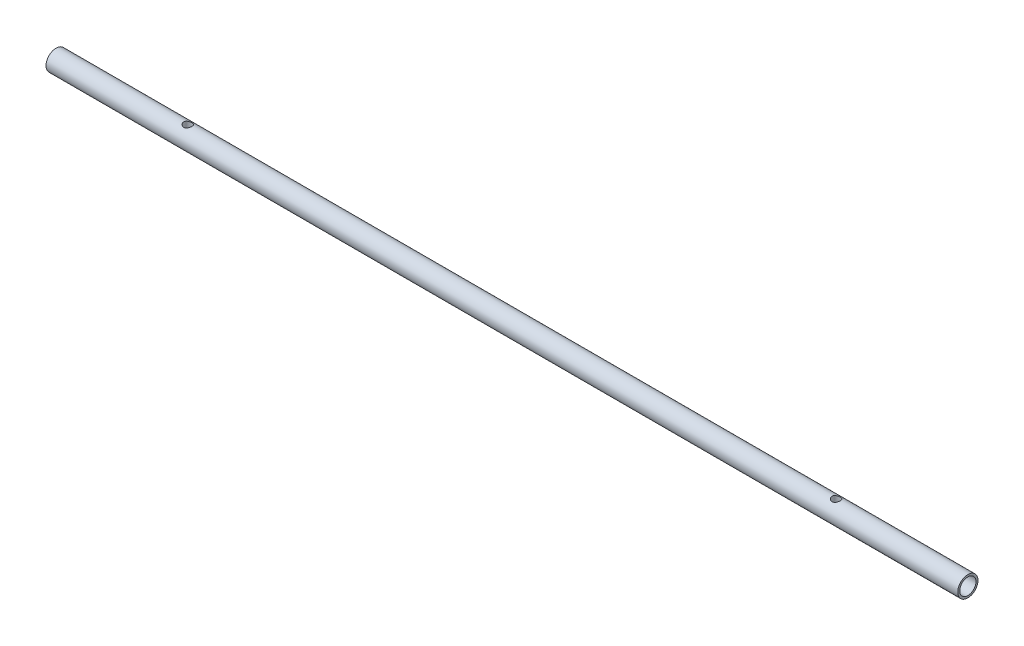
ISO-10303-21;
HEADER;
FILE_DESCRIPTION(('STEP AP214'),'2;1');
FILE_NAME('part.step','',(''),(''),'','','');
FILE_SCHEMA(('AUTOMOTIVE_DESIGN { 1 0 10303 214 1 1 1 1 }'));
ENDSEC;
DATA;
#1=APPLICATION_CONTEXT('core data for automotive mechanical design processes');
#2=APPLICATION_PROTOCOL_DEFINITION('international standard','automotive_design',2000,#1);
#3=PRODUCT_CONTEXT('',#1,'mechanical');
#4=PRODUCT('Part','Part','',(#3));
#5=PRODUCT_RELATED_PRODUCT_CATEGORY('part','',(#4));
#6=PRODUCT_DEFINITION_FORMATION('','',#4);
#7=PRODUCT_DEFINITION_CONTEXT('part definition',#1,'design');
#8=PRODUCT_DEFINITION('design','',#6,#7);
#9=PRODUCT_DEFINITION_SHAPE('','',#8);
#10=(LENGTH_UNIT() NAMED_UNIT(*) SI_UNIT(.MILLI.,.METRE.));
#11=(NAMED_UNIT(*) PLANE_ANGLE_UNIT() SI_UNIT($,.RADIAN.));
#12=(NAMED_UNIT(*) SI_UNIT($,.STERADIAN.) SOLID_ANGLE_UNIT());
#13=UNCERTAINTY_MEASURE_WITH_UNIT(LENGTH_MEASURE(1.E-05),#10,'distance_accuracy_value','');
#14=(GEOMETRIC_REPRESENTATION_CONTEXT(3) GLOBAL_UNCERTAINTY_ASSIGNED_CONTEXT((#13)) GLOBAL_UNIT_ASSIGNED_CONTEXT((#10,
#11,#12)) REPRESENTATION_CONTEXT('',''));
#15=CARTESIAN_POINT('',(0.,0.,0.));
#16=DIRECTION('',(0.,0.,1.));
#17=DIRECTION('',(1.,0.,0.));
#18=AXIS2_PLACEMENT_3D('',#15,#16,#17);
#19=CARTESIAN_POINT('',(900.,0.,0.));
#20=DIRECTION('',(-1.,0.,0.));
#21=DIRECTION('',(0.,0.,1.));
#22=AXIS2_PLACEMENT_3D('',#19,#20,#21);
#23=CYLINDRICAL_SURFACE('',#22,10.);
#24=CARTESIAN_POINT('',(900.,0.,0.));
#25=DIRECTION('',(1.,0.,0.));
#26=DIRECTION('',(0.,0.,-1.));
#27=AXIS2_PLACEMENT_3D('',#24,#25,#26);
#28=CIRCLE('',#27,10.);
#29=CARTESIAN_POINT('',(900.,0.,-10.));
#30=VERTEX_POINT('',#29);
#31=EDGE_CURVE('E10',#30,#30,#28,.T.);
#32=ORIENTED_EDGE('',*,*,#31,.F.);
#33=EDGE_LOOP('',(#32));
#34=FACE_BOUND('',#33,.T.);
#35=CARTESIAN_POINT('',(0.,0.,0.));
#36=DIRECTION('',(1.,0.,0.));
#37=DIRECTION('',(0.,0.,-1.));
#38=AXIS2_PLACEMENT_3D('',#35,#36,#37);
#39=CIRCLE('',#38,10.);
#40=CARTESIAN_POINT('',(0.,0.,-10.));
#41=VERTEX_POINT('',#40);
#42=EDGE_CURVE('E47',#41,#41,#39,.T.);
#43=ORIENTED_EDGE('',*,*,#42,.T.);
#44=EDGE_LOOP('',(#43));
#45=FACE_BOUND('',#44,.T.);
#46=CARTESIAN_POINT('',(770.,-9.1651513899117,-3.99999999999996));
#47=CARTESIAN_POINT('',(770.107177496784,-9.16515220722508,-3.99999917996681));
#48=CARTESIAN_POINT('',(770.214387859795,-9.1670378270459,-3.99568627578827));
#49=CARTESIAN_POINT('',(770.428032094171,-9.1745189058127,-3.97847804504311));
#50=CARTESIAN_POINT('',(770.534465449945,-9.18011663538448,-3.96557746554294));
#51=CARTESIAN_POINT('',(770.745935953355,-9.19485078616076,-3.93129357708775));
#52=CARTESIAN_POINT('',(770.850969884849,-9.20399425848328,-3.90989336356568));
#53=CARTESIAN_POINT('',(771.05868759719,-9.22551446198261,-3.85883937208576));
#54=CARTESIAN_POINT('',(771.161370383102,-9.23789253541713,-3.82918216740125));
#55=CARTESIAN_POINT('',(771.463989726629,-9.27920231487637,-3.72849978450441));
#56=CARTESIAN_POINT('',(771.659537920964,-9.31238810193526,-3.6455922809956));
#57=CARTESIAN_POINT('',(772.033801268673,-9.38629512671439,-3.45083256453886));
#58=CARTESIAN_POINT('',(772.212520085891,-9.42701471853534,-3.33898667159602));
#59=CARTESIAN_POINT('',(772.558511813601,-9.51401677460926,-3.08264624953203));
#60=CARTESIAN_POINT('',(772.724710433289,-9.56047821792021,-2.93675933272146));
#61=CARTESIAN_POINT('',(773.031060408042,-9.65224928088017,-2.61941759406607));
#62=CARTESIAN_POINT('',(773.171202660755,-9.69755849326326,-2.44795387495429));
#63=CARTESIAN_POINT('',(773.426812109837,-9.78406811808173,-2.07601279575006));
#64=CARTESIAN_POINT('',(773.541088419969,-9.82503606295844,-1.87465797803879));
#65=CARTESIAN_POINT('',(773.733687319677,-9.89607856333947,-1.45365059895523));
#66=CARTESIAN_POINT('',(773.812024539433,-9.92615755049621,-1.23400552632842));
#67=CARTESIAN_POINT('',(773.926682927323,-9.97076649749864,-0.793932865332514));
#68=CARTESIAN_POINT('',(773.964854615998,-9.98597873479394,-0.574057972725617));
#69=CARTESIAN_POINT('',(774.004056983501,-10.001606214367,-0.13053265416026));
#70=CARTESIAN_POINT('',(774.005101515044,-10.0020269755724,0.0931163324630192));
#71=CARTESIAN_POINT('',(773.971034457453,-9.98843925626006,0.524464988663833));
#72=CARTESIAN_POINT('',(773.937950453703,-9.97523993538891,0.73235490554236));
#73=CARTESIAN_POINT('',(773.840014248182,-9.93698582942364,1.13934621864219));
#74=CARTESIAN_POINT('',(773.775159715415,-9.91193017443786,1.33844696883592));
#75=CARTESIAN_POINT('',(773.614727034028,-9.85193648913818,1.72579587696661));
#76=CARTESIAN_POINT('',(773.518700570311,-9.81685520932149,1.91383524674304));
#77=CARTESIAN_POINT('',(773.29906998622,-9.74029170360854,2.27161630149706));
#78=CARTESIAN_POINT('',(773.175456413816,-9.69880728534385,2.44135168543978));
#79=CARTESIAN_POINT('',(772.894701728095,-9.61043274352162,2.76953765597588));
#80=CARTESIAN_POINT('',(772.73589221485,-9.56336653023499,2.92651569053131));
#81=CARTESIAN_POINT('',(772.394018856341,-9.47123321946556,3.21221483078627));
#82=CARTESIAN_POINT('',(772.21094710361,-9.42616678016166,3.34092668757409));
#83=CARTESIAN_POINT('',(771.819161955251,-9.34193794818047,3.56980837743803));
#84=CARTESIAN_POINT('',(771.609870339322,-9.30297828115422,3.66906930327224));
#85=CARTESIAN_POINT('',(771.175569019376,-9.23775180688179,3.83035251973281));
#86=CARTESIAN_POINT('',(770.950569630547,-9.2114767578263,3.8923989967558));
#87=CARTESIAN_POINT('',(770.505928445065,-9.1765951940544,3.97390989770958));
#88=CARTESIAN_POINT('',(770.286799105743,-9.16700732912284,3.99574419362888));
#89=CARTESIAN_POINT('',(769.847845584481,-9.16378995738086,4.00312265288558));
#90=CARTESIAN_POINT('',(769.628021633449,-9.17015561120733,3.98867782118237));
#91=CARTESIAN_POINT('',(769.207082130086,-9.19712088718237,3.92606578957984));
#92=CARTESIAN_POINT('',(769.0056141252,-9.21688915596613,3.87986612404747));
#93=CARTESIAN_POINT('',(768.613423190429,-9.26740102054689,3.75760837382151));
#94=CARTESIAN_POINT('',(768.422702653785,-9.29814704977204,3.68154366860436));
#95=CARTESIAN_POINT('',(768.048795284409,-9.36867563720211,3.49827127896289));
#96=CARTESIAN_POINT('',(767.866227622613,-9.40877409278365,3.38992573652891));
#97=CARTESIAN_POINT('',(767.521034025115,-9.49300770315595,3.14633044888357));
#98=CARTESIAN_POINT('',(767.358416254402,-9.53714449792086,3.01106974696415));
#99=CARTESIAN_POINT('',(767.045253182809,-9.62841831942848,2.70568842336037));
#100=CARTESIAN_POINT('',(766.896486869446,-9.67553614570512,2.53373085888834));
#101=CARTESIAN_POINT('',(766.629645846752,-9.76439589135028,2.16616726673914));
#102=CARTESIAN_POINT('',(766.511572386703,-9.80613759186125,1.97056027694174));
#103=CARTESIAN_POINT('',(766.309904747181,-9.87967431800932,1.56055986799716));
#104=CARTESIAN_POINT('',(766.226302312053,-9.91147172481882,1.34617096196484));
#105=CARTESIAN_POINT('',(766.096902294801,-9.9614542693725,0.904787181861416));
#106=CARTESIAN_POINT('',(766.051084195687,-9.9796467941012,0.677799220674651));
#107=CARTESIAN_POINT('',(766.000990598089,-9.99958016425669,0.233633020611835));
#108=CARTESIAN_POINT('',(765.994199747923,-10.0023169350655,0.0167809848941689));
#109=CARTESIAN_POINT('',(766.015710953721,-9.9937208474038,-0.414867671174849));
#110=CARTESIAN_POINT('',(766.044007697521,-9.98239011871254,-0.629664597703008));
#111=CARTESIAN_POINT('',(766.133093594213,-9.94743026789157,-1.04434180494589));
#112=CARTESIAN_POINT('',(766.192857956505,-9.92418961491738,-1.24447761316997));
#113=CARTESIAN_POINT('',(766.342105544758,-9.86789895440955,-1.63184470564409));
#114=CARTESIAN_POINT('',(766.431594252056,-9.83484713776135,-1.81907360209117));
#115=CARTESIAN_POINT('',(766.642206647569,-9.76036189588763,-2.18440609879399));
#116=CARTESIAN_POINT('',(766.764553544096,-9.71862262764551,-2.36174083104884));
#117=CARTESIAN_POINT('',(767.035576083636,-9.63178803063431,-2.6941079995884));
#118=CARTESIAN_POINT('',(767.184262624039,-9.58669131729773,-2.84913115669901));
#119=CARTESIAN_POINT('',(767.514634238866,-9.49475540255922,-3.14240275826144));
#120=CARTESIAN_POINT('',(767.697792298702,-9.44798115653708,-3.27901865020177));
#121=CARTESIAN_POINT('',(768.085869721248,-9.36099292501488,-3.51969402497225));
#122=CARTESIAN_POINT('',(768.290791638666,-9.32077971107737,-3.62374968011084));
#123=CARTESIAN_POINT('',(768.69812394378,-9.25517900642369,-3.78798515690828));
#124=CARTESIAN_POINT('',(768.899107675946,-9.22878451494603,-3.85126569346865));
#125=CARTESIAN_POINT('',(769.206638959791,-9.19885565843391,-3.92194632104982));
#126=CARTESIAN_POINT('',(769.310073035894,-9.19049270633768,-3.94146052144915));
#127=CARTESIAN_POINT('',(769.518356929611,-9.17721200341613,-3.9722885067968));
#128=CARTESIAN_POINT('',(769.623205889396,-9.17229225293173,-3.98360705155151));
#129=CARTESIAN_POINT('',(769.773550591352,-9.16783675423419,-3.99384232103279));
#130=CARTESIAN_POINT('',(769.818799830322,-9.16683059815416,-3.99615058414989));
#131=CARTESIAN_POINT('',(769.909364084215,-9.16548771864779,-3.99922965337519));
#132=CARTESIAN_POINT('',(769.954679103716,-9.16515104430394,-4.00000034675779));
#133=CARTESIAN_POINT('',(770.,-9.1651513899117,-3.99999999999996));
#134=B_SPLINE_CURVE_WITH_KNOTS('',3,(#46,#47,#48,#49,#50,#51,#52,#53,#54,#55,#56,#57,#58,#59,
#60,#61,#62,#63,#64,#65,#66,#67,#68,#69,#70,#71,#72,#73,#74,#75,#76,#77,#78,#79,#80,#81,#82,#83,
#84,#85,#86,#87,#88,#89,#90,#91,#92,#93,#94,#95,#96,#97,#98,#99,#100,#101,#102,#103,#104,#105,
#106,#107,#108,#109,#110,#111,#112,#113,#114,#115,#116,#117,#118,#119,#120,#121,#122,#123,#124,
#125,#126,#127,#128,#129,#130,#131,#132,#133),.UNSPECIFIED.,.T.,.F.,(4,2,2,2,2,2,2,2,2,2,2,2,2,
2,2,2,2,2,2,2,2,2,2,2,2,2,2,2,2,2,2,2,2,2,2,2,2,2,2,2,2,2,2,4),(0.,0.321486083338427,
0.643168995111234,0.965494918272602,1.28795480954357,1.92974178448591,2.57138871437629,
3.2463125035875,3.92147162486584,4.62325351972751,5.32474947728853,5.9922837956426,
6.65956904401237,7.28937303450495,7.9192232404801,8.55856614259682,9.19812843669946,
9.87968101952588,10.5614562804413,11.262489312244,11.9630662339009,12.6208430883872,
13.2784204360576,13.8985450996018,14.5188073109315,15.1642232309528,15.8099024284157,
16.5032748228382,17.1966754349536,17.8899098841549,18.5827676569813,19.2304209330176,
19.8779761681506,20.5056400267656,21.1334196944702,21.788941160697,22.4447344691826,
23.1411252036108,23.8375977730822,24.47153335428,24.7879924179089,25.1042675432741,
25.2402006430812,25.3761437083403),.UNSPECIFIED.);
#135=CARTESIAN_POINT('',(770.,-9.1651513899117,-3.99999999999996));
#136=VERTEX_POINT('',#135);
#137=EDGE_CURVE('E58',#136,#136,#134,.T.);
#138=ORIENTED_EDGE('',*,*,#137,.F.);
#139=EDGE_LOOP('',(#138));
#140=FACE_BOUND('',#139,.T.);
#141=CARTESIAN_POINT('',(770.,9.1651513899117,-3.99999999999996));
#142=CARTESIAN_POINT('',(769.892822503216,9.16515220722508,-3.99999917996681));
#143=CARTESIAN_POINT('',(769.785612140205,9.1670378270459,-3.99568627578827));
#144=CARTESIAN_POINT('',(769.571967905829,9.1745189058127,-3.97847804504311));
#145=CARTESIAN_POINT('',(769.465534550055,9.18011663538448,-3.96557746554295));
#146=CARTESIAN_POINT('',(769.254064046645,9.19485078616075,-3.93129357708776));
#147=CARTESIAN_POINT('',(769.149030115152,9.20399425848328,-3.90989336356569));
#148=CARTESIAN_POINT('',(768.94131240281,9.22551446198261,-3.85883937208576));
#149=CARTESIAN_POINT('',(768.838629616898,9.23789253541713,-3.82918216740125));
#150=CARTESIAN_POINT('',(768.536010273372,9.27920231487637,-3.72849978450441));
#151=CARTESIAN_POINT('',(768.340462079036,9.31238810193526,-3.6455922809956));
#152=CARTESIAN_POINT('',(767.966198731327,9.38629512671439,-3.45083256453886));
#153=CARTESIAN_POINT('',(767.787479914109,9.42701471853534,-3.33898667159601));
#154=CARTESIAN_POINT('',(767.441488186399,9.51401677460926,-3.08264624953205));
#155=CARTESIAN_POINT('',(767.275289566711,9.5604782179202,-2.93675933272151));
#156=CARTESIAN_POINT('',(766.968939591958,9.65224928088016,-2.61941759406611));
#157=CARTESIAN_POINT('',(766.828797339245,9.69755849326325,-2.4479538749543));
#158=CARTESIAN_POINT('',(766.573187890163,9.78406811808173,-2.07601279575006));
#159=CARTESIAN_POINT('',(766.458911580031,9.82503606295844,-1.87465797803879));
#160=CARTESIAN_POINT('',(766.266312680323,9.89607856333947,-1.45365059895523));
#161=CARTESIAN_POINT('',(766.187975460567,9.92615755049621,-1.23400552632842));
#162=CARTESIAN_POINT('',(766.073317072677,9.97076649749864,-0.793932865332513));
#163=CARTESIAN_POINT('',(766.035145384002,9.98597873479394,-0.574057972725617));
#164=CARTESIAN_POINT('',(765.995943016499,10.001606214367,-0.13053265416026));
#165=CARTESIAN_POINT('',(765.994898484956,10.0020269755724,0.0931163324630191));
#166=CARTESIAN_POINT('',(766.028965542547,9.98843925626006,0.524464988663833));
#167=CARTESIAN_POINT('',(766.062049546297,9.97523993538891,0.73235490554236));
#168=CARTESIAN_POINT('',(766.159985751818,9.93698582942364,1.13934621864219));
#169=CARTESIAN_POINT('',(766.224840284585,9.91193017443786,1.33844696883592));
#170=CARTESIAN_POINT('',(766.385272965972,9.85193648913818,1.72579587696661));
#171=CARTESIAN_POINT('',(766.481299429689,9.81685520932149,1.91383524674304));
#172=CARTESIAN_POINT('',(766.700930013781,9.74029170360854,2.27161630149706));
#173=CARTESIAN_POINT('',(766.824543586184,9.69880728534385,2.44135168543978));
#174=CARTESIAN_POINT('',(767.105298271905,9.61043274352162,2.76953765597588));
#175=CARTESIAN_POINT('',(767.26410778515,9.56336653023499,2.92651569053131));
#176=CARTESIAN_POINT('',(767.605981143659,9.47123321946556,3.21221483078627));
#177=CARTESIAN_POINT('',(767.78905289639,9.42616678016166,3.34092668757409));
#178=CARTESIAN_POINT('',(768.180838044749,9.34193794818046,3.56980837743807));
#179=CARTESIAN_POINT('',(768.390129660678,9.30297828115419,3.6690693032723));
#180=CARTESIAN_POINT('',(768.824430980624,9.23775180688177,3.83035251973285));
#181=CARTESIAN_POINT('',(769.049430369453,9.2114767578263,3.89239899675581));
#182=CARTESIAN_POINT('',(769.494071554935,9.1765951940544,3.97390989770958));
#183=CARTESIAN_POINT('',(769.713200894257,9.16700732912284,3.99574419362888));
#184=CARTESIAN_POINT('',(770.152154415519,9.16378995738086,4.00312265288558));
#185=CARTESIAN_POINT('',(770.371978366552,9.17015561120733,3.98867782118237));
#186=CARTESIAN_POINT('',(770.792917869914,9.19712088718237,3.92606578957984));
#187=CARTESIAN_POINT('',(770.9943858748,9.21688915596613,3.87986612404747));
#188=CARTESIAN_POINT('',(771.386576809571,9.26740102054689,3.75760837382151));
#189=CARTESIAN_POINT('',(771.577297346215,9.29814704977204,3.68154366860436));
#190=CARTESIAN_POINT('',(771.951204715591,9.36867563720211,3.49827127896289));
#191=CARTESIAN_POINT('',(772.133772377387,9.40877409278365,3.38992573652891));
#192=CARTESIAN_POINT('',(772.478965974885,9.49300770315595,3.14633044888357));
#193=CARTESIAN_POINT('',(772.641583745598,9.53714449792086,3.01106974696415));
#194=CARTESIAN_POINT('',(772.954746817191,9.62841831942848,2.70568842336037));
#195=CARTESIAN_POINT('',(773.103513130554,9.67553614570512,2.53373085888834));
#196=CARTESIAN_POINT('',(773.370354153248,9.76439589135028,2.16616726673914));
#197=CARTESIAN_POINT('',(773.488427613297,9.80613759186125,1.97056027694174));
#198=CARTESIAN_POINT('',(773.690095252819,9.87967431800932,1.56055986799716));
#199=CARTESIAN_POINT('',(773.773697687947,9.91147172481882,1.34617096196484));
#200=CARTESIAN_POINT('',(773.903097705199,9.9614542693725,0.904787181861416));
#201=CARTESIAN_POINT('',(773.948915804313,9.9796467941012,0.677799220674651));
#202=CARTESIAN_POINT('',(773.999009401911,9.99958016425669,0.233633020611837));
#203=CARTESIAN_POINT('',(774.005800252077,10.0023169350655,0.0167809848941722));
#204=CARTESIAN_POINT('',(773.98428904628,9.9937208474038,-0.414867671174845));
#205=CARTESIAN_POINT('',(773.955992302479,9.98239011871254,-0.629664597703005));
#206=CARTESIAN_POINT('',(773.866906405787,9.94743026789157,-1.04434180494591));
#207=CARTESIAN_POINT('',(773.807142043495,9.92418961491737,-1.24447761317));
#208=CARTESIAN_POINT('',(773.657894455242,9.86789895440954,-1.63184470564411));
#209=CARTESIAN_POINT('',(773.568405747944,9.83484713776135,-1.81907360209118));
#210=CARTESIAN_POINT('',(773.357793352431,9.76036189588763,-2.18440609879398));
#211=CARTESIAN_POINT('',(773.235446455904,9.71862262764551,-2.36174083104884));
#212=CARTESIAN_POINT('',(772.964423916364,9.63178803063431,-2.6941079995884));
#213=CARTESIAN_POINT('',(772.815737375961,9.58669131729773,-2.84913115669901));
#214=CARTESIAN_POINT('',(772.485365761134,9.49475540255923,-3.14240275826141));
#215=CARTESIAN_POINT('',(772.302207701298,9.44798115653709,-3.27901865020174));
#216=CARTESIAN_POINT('',(771.914130278752,9.36099292501489,-3.51969402497223));
#217=CARTESIAN_POINT('',(771.709208361334,9.32077971107738,-3.62374968011083));
#218=CARTESIAN_POINT('',(771.30187605622,9.25517900642369,-3.78798515690827));
#219=CARTESIAN_POINT('',(771.100892324054,9.22878451494603,-3.85126569346865));
#220=CARTESIAN_POINT('',(770.793361040209,9.19885565843391,-3.92194632104982));
#221=CARTESIAN_POINT('',(770.689926964106,9.19049270633768,-3.94146052144915));
#222=CARTESIAN_POINT('',(770.481643070389,9.17721200341613,-3.9722885067968));
#223=CARTESIAN_POINT('',(770.376794110604,9.17229225293173,-3.98360705155151));
#224=CARTESIAN_POINT('',(770.226449408648,9.16783675423419,-3.99384232103279));
#225=CARTESIAN_POINT('',(770.181200169678,9.16683059815416,-3.99615058414989));
#226=CARTESIAN_POINT('',(770.090635915785,9.16548771864779,-3.99922965337519));
#227=CARTESIAN_POINT('',(770.045320896284,9.16515104430394,-4.00000034675779));
#228=CARTESIAN_POINT('',(770.,9.1651513899117,-3.99999999999996));
#229=B_SPLINE_CURVE_WITH_KNOTS('',3,(#141,#142,#143,#144,#145,#146,#147,#148,#149,#150,#151,
#152,#153,#154,#155,#156,#157,#158,#159,#160,#161,#162,#163,#164,#165,#166,#167,#168,#169,#170,
#171,#172,#173,#174,#175,#176,#177,#178,#179,#180,#181,#182,#183,#184,#185,#186,#187,#188,#189,
#190,#191,#192,#193,#194,#195,#196,#197,#198,#199,#200,#201,#202,#203,#204,#205,#206,#207,#208,
#209,#210,#211,#212,#213,#214,#215,#216,#217,#218,#219,#220,#221,#222,#223,#224,#225,#226,#227,
#228),.UNSPECIFIED.,.T.,.F.,(4,2,2,2,2,2,2,2,2,2,2,2,2,2,2,2,2,2,2,2,2,2,2,2,2,2,2,2,2,2,2,2,2,
2,2,2,2,2,2,2,2,2,2,4),(0.,0.321486083338427,0.643168995111122,0.965494918272602,
1.28795480954357,1.92974178448591,2.57138871437629,3.24631250358746,3.92147162486584,
4.62325351972751,5.32474947728854,5.9922837956426,6.65956904401238,7.28937303450496,
7.91922324048011,8.55856614259683,9.19812843669947,9.87968101952589,10.5614562804413,
11.2624893122442,11.9630662339009,12.6208430883872,13.2784204360576,13.8985450996018,
14.5188073109315,15.1642232309528,15.8099024284157,16.5032748228383,17.1966754349536,
17.8899098841549,18.5827676569813,19.2304209330176,19.8779761681506,20.5056400267656,
21.1334196944702,21.788941160697,22.4447344691826,23.1411252036107,23.8375977730822,
24.47153335428,24.7879924179089,25.1042675432741,25.2402006430812,25.3761437083403),.UNSPECIFIED.);
#230=CARTESIAN_POINT('',(770.,9.1651513899117,-3.99999999999996));
#231=VERTEX_POINT('',#230);
#232=EDGE_CURVE('E69',#231,#231,#229,.T.);
#233=ORIENTED_EDGE('',*,*,#232,.F.);
#234=EDGE_LOOP('',(#233));
#235=FACE_BOUND('',#234,.T.);
#236=CARTESIAN_POINT('',(130.,-9.16515138991168,-3.99999999999999));
#237=CARTESIAN_POINT('',(130.107177496784,-9.16515220722506,-3.99999917996684));
#238=CARTESIAN_POINT('',(130.214387859795,-9.16703782704588,-3.99568627578831));
#239=CARTESIAN_POINT('',(130.428032094171,-9.17451890581268,-3.97847804504314));
#240=CARTESIAN_POINT('',(130.534465449945,-9.18011663538446,-3.96557746554299));
#241=CARTESIAN_POINT('',(130.745935953356,-9.19485078616074,-3.93129357708779));
#242=CARTESIAN_POINT('',(130.850969884849,-9.20399425848327,-3.9098933635657));
#243=CARTESIAN_POINT('',(131.05868759719,-9.2255144619826,-3.85883937208578));
#244=CARTESIAN_POINT('',(131.161370383102,-9.23789253541713,-3.82918216740127));
#245=CARTESIAN_POINT('',(131.463989726629,-9.27920231487636,-3.72849978450444));
#246=CARTESIAN_POINT('',(131.659537920964,-9.31238810193525,-3.64559228099562));
#247=CARTESIAN_POINT('',(132.033801268673,-9.38629512671437,-3.45083256453888));
#248=CARTESIAN_POINT('',(132.212520085891,-9.42701471853534,-3.33898667159603));
#249=CARTESIAN_POINT('',(132.558511813601,-9.51401677460927,-3.08264624953202));
#250=CARTESIAN_POINT('',(132.724710433289,-9.56047821792022,-2.93675933272145));
#251=CARTESIAN_POINT('',(133.031060408042,-9.65224928088018,-2.61941759406606));
#252=CARTESIAN_POINT('',(133.171202660755,-9.69755849326326,-2.44795387495429));
#253=CARTESIAN_POINT('',(133.426812109837,-9.78406811808173,-2.07601279575004));
#254=CARTESIAN_POINT('',(133.541088419969,-9.82503606295845,-1.87465797803873));
#255=CARTESIAN_POINT('',(133.733687319677,-9.89607856333948,-1.45365059895514));
#256=CARTESIAN_POINT('',(133.812024539433,-9.92615755049622,-1.23400552632834));
#257=CARTESIAN_POINT('',(133.926682927323,-9.97076649749865,-0.793932865332435));
#258=CARTESIAN_POINT('',(133.964854615998,-9.98597873479395,-0.57405797272553));
#259=CARTESIAN_POINT('',(134.004056983501,-10.001606214367,-0.130532654160165));
#260=CARTESIAN_POINT('',(134.005101515044,-10.0020269755724,0.0931163324631123));
#261=CARTESIAN_POINT('',(133.971034457454,-9.98843925626006,0.524464988663923));
#262=CARTESIAN_POINT('',(133.937950453703,-9.97523993538891,0.732354905542449));
#263=CARTESIAN_POINT('',(133.840014248182,-9.93698582942363,1.13934621864229));
#264=CARTESIAN_POINT('',(133.775159715416,-9.91193017443785,1.33844696883603));
#265=CARTESIAN_POINT('',(133.614727034028,-9.85193648913816,1.72579587696674));
#266=CARTESIAN_POINT('',(133.518700570311,-9.81685520932147,1.91383524674318));
#267=CARTESIAN_POINT('',(133.29906998622,-9.7402917036085,2.27161630149722));
#268=CARTESIAN_POINT('',(133.175456413816,-9.69880728534381,2.44135168543995));
#269=CARTESIAN_POINT('',(132.894701728095,-9.61043274352157,2.76953765597605));
#270=CARTESIAN_POINT('',(132.73589221485,-9.56336653023494,2.92651569053148));
#271=CARTESIAN_POINT('',(132.394018856341,-9.4712332194655,3.21221483078644));
#272=CARTESIAN_POINT('',(132.21094710361,-9.42616678016159,3.34092668757427));
#273=CARTESIAN_POINT('',(131.819161955251,-9.3419379481804,3.56980837743822));
#274=CARTESIAN_POINT('',(131.609870339322,-9.30297828115414,3.66906930327243));
#275=CARTESIAN_POINT('',(131.175569019376,-9.23775180688171,3.83035251973299));
#276=CARTESIAN_POINT('',(130.950569630547,-9.21147675782623,3.89239899675598));
#277=CARTESIAN_POINT('',(130.505928445065,-9.17659519405432,3.97390989770977));
#278=CARTESIAN_POINT('',(130.286799105743,-9.16700732912276,3.99574419362907));
#279=CARTESIAN_POINT('',(129.847845584481,-9.16378995738077,4.00312265288577));
#280=CARTESIAN_POINT('',(129.628021633449,-9.17015561120725,3.98867782118256));
#281=CARTESIAN_POINT('',(129.207082130086,-9.19712088718227,3.92606578958005));
#282=CARTESIAN_POINT('',(129.0056141252,-9.21688915596603,3.87986612404771));
#283=CARTESIAN_POINT('',(128.613423190429,-9.2674010205468,3.75760837382175));
#284=CARTESIAN_POINT('',(128.422702653785,-9.29814704977196,3.68154366860459));
#285=CARTESIAN_POINT('',(128.048795284409,-9.36867563720204,3.4982712789631));
#286=CARTESIAN_POINT('',(127.866227622613,-9.40877409278358,3.38992573652913));
#287=CARTESIAN_POINT('',(127.521034025115,-9.49300770315588,3.14633044888378));
#288=CARTESIAN_POINT('',(127.358416254402,-9.5371444979208,3.01106974696434));
#289=CARTESIAN_POINT('',(127.045253182809,-9.62841831942844,2.70568842336054));
#290=CARTESIAN_POINT('',(126.896486869445,-9.67553614570507,2.53373085888853));
#291=CARTESIAN_POINT('',(126.629645846752,-9.76439589135024,2.16616726673933));
#292=CARTESIAN_POINT('',(126.511572386703,-9.80613759186121,1.97056027694192));
#293=CARTESIAN_POINT('',(126.309904747181,-9.87967431800929,1.56055986799733));
#294=CARTESIAN_POINT('',(126.226302312053,-9.9114717248188,1.346170961965));
#295=CARTESIAN_POINT('',(126.096902294801,-9.96145426937249,0.904787181861574));
#296=CARTESIAN_POINT('',(126.051084195687,-9.97964679410119,0.677799220674806));
#297=CARTESIAN_POINT('',(126.000990598089,-9.99958016425668,0.233633020611984));
#298=CARTESIAN_POINT('',(125.994199747923,-10.0023169350655,0.0167809848943151));
#299=CARTESIAN_POINT('',(126.01571095372,-9.99372084740381,-0.414867671174713));
#300=CARTESIAN_POINT('',(126.044007697521,-9.98239011871255,-0.629664597702879));
#301=CARTESIAN_POINT('',(126.133093594213,-9.94743026789158,-1.0443418049458));
#302=CARTESIAN_POINT('',(126.192857956505,-9.92418961491739,-1.24447761316989));
#303=CARTESIAN_POINT('',(126.342105544758,-9.86789895440956,-1.63184470564402));
#304=CARTESIAN_POINT('',(126.431594252056,-9.83484713776136,-1.8190736020911));
#305=CARTESIAN_POINT('',(126.642206647568,-9.76036189588765,-2.18440609879391));
#306=CARTESIAN_POINT('',(126.764553544096,-9.71862262764552,-2.36174083104878));
#307=CARTESIAN_POINT('',(127.035576083636,-9.63178803063432,-2.69410799958835));
#308=CARTESIAN_POINT('',(127.184262624039,-9.58669131729774,-2.84913115669897));
#309=CARTESIAN_POINT('',(127.514634238866,-9.49475540255924,-3.14240275826138));
#310=CARTESIAN_POINT('',(127.697792298702,-9.44798115653711,-3.2790186502017));
#311=CARTESIAN_POINT('',(128.085869721248,-9.3609929250149,-3.5196940249722));
#312=CARTESIAN_POINT('',(128.290791638666,-9.32077971107739,-3.62374968011081));
#313=CARTESIAN_POINT('',(128.69812394378,-9.2551790064237,-3.78798515690825));
#314=CARTESIAN_POINT('',(128.899107675946,-9.22878451494604,-3.85126569346863));
#315=CARTESIAN_POINT('',(129.206638959791,-9.19885565843391,-3.92194632104981));
#316=CARTESIAN_POINT('',(129.310073035894,-9.19049270633768,-3.94146052144916));
#317=CARTESIAN_POINT('',(129.518356929611,-9.17721200341612,-3.97228850679682));
#318=CARTESIAN_POINT('',(129.623205889396,-9.17229225293172,-3.98360705155153));
#319=CARTESIAN_POINT('',(129.773550591352,-9.16783675423417,-3.99384232103282));
#320=CARTESIAN_POINT('',(129.818799830322,-9.16683059815414,-3.99615058414992));
#321=CARTESIAN_POINT('',(129.909364084215,-9.16548771864777,-3.99922965337523));
#322=CARTESIAN_POINT('',(129.954679103716,-9.16515104430392,-4.00000034675783));
#323=CARTESIAN_POINT('',(130.,-9.16515138991168,-3.99999999999999));
#324=B_SPLINE_CURVE_WITH_KNOTS('',3,(#236,#237,#238,#239,#240,#241,#242,#243,#244,#245,#246,
#247,#248,#249,#250,#251,#252,#253,#254,#255,#256,#257,#258,#259,#260,#261,#262,#263,#264,#265,
#266,#267,#268,#269,#270,#271,#272,#273,#274,#275,#276,#277,#278,#279,#280,#281,#282,#283,#284,
#285,#286,#287,#288,#289,#290,#291,#292,#293,#294,#295,#296,#297,#298,#299,#300,#301,#302,#303,
#304,#305,#306,#307,#308,#309,#310,#311,#312,#313,#314,#315,#316,#317,#318,#319,#320,#321,#322,
#323),.UNSPECIFIED.,.T.,.F.,(4,2,2,2,2,2,2,2,2,2,2,2,2,2,2,2,2,2,2,2,2,2,2,2,2,2,2,2,2,2,2,2,2,
2,2,2,2,2,2,2,2,2,2,4),(0.,0.3214860833384,0.643168995111206,0.965494918272717,1.28795480954363,
1.92974178448589,2.57138871437638,3.24631250358762,3.92147162486597,4.62325351972769,
5.32474947728873,5.99228379564279,6.65956904401255,7.28937303450516,7.91922324048031,
8.55856614259708,9.19812843669974,9.87968101952623,10.5614562804417,11.2624893122443,
11.9630662339011,12.6208430883875,13.2784204360579,13.898545099602,14.5188073109319,
15.1642232309531,15.8099024284161,16.5032748228387,17.196675434954,17.8899098841553,
18.5827676569818,19.2304209330181,19.8779761681511,20.5056400267661,21.1334196944708,
21.7889411606976,22.4447344691832,23.1411252036113,23.8375977730828,24.4715333542805,
24.7879924179095,25.1042675432748,25.2402006430819,25.3761437083411),.UNSPECIFIED.);
#325=CARTESIAN_POINT('',(130.,-9.16515138991168,-3.99999999999999));
#326=VERTEX_POINT('',#325);
#327=EDGE_CURVE('E116',#326,#326,#324,.T.);
#328=ORIENTED_EDGE('',*,*,#327,.F.);
#329=EDGE_LOOP('',(#328));
#330=FACE_BOUND('',#329,.T.);
#331=CARTESIAN_POINT('',(130.,9.16515138991168,-3.99999999999999));
#332=CARTESIAN_POINT('',(129.892822503216,9.16515220722506,-3.99999917996684));
#333=CARTESIAN_POINT('',(129.785612140205,9.16703782704588,-3.99568627578831));
#334=CARTESIAN_POINT('',(129.571967905829,9.17451890581268,-3.97847804504314));
#335=CARTESIAN_POINT('',(129.465534550055,9.18011663538446,-3.96557746554299));
#336=CARTESIAN_POINT('',(129.254064046644,9.19485078616074,-3.93129357708779));
#337=CARTESIAN_POINT('',(129.149030115151,9.20399425848327,-3.9098933635657));
#338=CARTESIAN_POINT('',(128.94131240281,9.2255144619826,-3.85883937208578));
#339=CARTESIAN_POINT('',(128.838629616898,9.23789253541713,-3.82918216740127));
#340=CARTESIAN_POINT('',(128.536010273371,9.27920231487636,-3.72849978450444));
#341=CARTESIAN_POINT('',(128.340462079036,9.31238810193525,-3.64559228099562));
#342=CARTESIAN_POINT('',(127.966198731327,9.38629512671437,-3.45083256453888));
#343=CARTESIAN_POINT('',(127.787479914109,9.42701471853534,-3.33898667159603));
#344=CARTESIAN_POINT('',(127.441488186399,9.51401677460927,-3.08264624953202));
#345=CARTESIAN_POINT('',(127.275289566711,9.56047821792022,-2.93675933272145));
#346=CARTESIAN_POINT('',(126.968939591958,9.65224928088018,-2.61941759406606));
#347=CARTESIAN_POINT('',(126.828797339245,9.69755849326326,-2.44795387495429));
#348=CARTESIAN_POINT('',(126.573187890163,9.78406811808173,-2.07601279575004));
#349=CARTESIAN_POINT('',(126.458911580031,9.82503606295845,-1.87465797803873));
#350=CARTESIAN_POINT('',(126.266312680323,9.89607856333948,-1.45365059895514));
#351=CARTESIAN_POINT('',(126.187975460567,9.92615755049622,-1.23400552632834));
#352=CARTESIAN_POINT('',(126.073317072677,9.97076649749865,-0.793932865332435));
#353=CARTESIAN_POINT('',(126.035145384002,9.98597873479395,-0.57405797272553));
#354=CARTESIAN_POINT('',(125.995943016499,10.001606214367,-0.130532654160165));
#355=CARTESIAN_POINT('',(125.994898484956,10.0020269755724,0.0931163324631123));
#356=CARTESIAN_POINT('',(126.028965542546,9.98843925626006,0.524464988663923));
#357=CARTESIAN_POINT('',(126.062049546297,9.97523993538891,0.732354905542449));
#358=CARTESIAN_POINT('',(126.159985751818,9.93698582942363,1.13934621864229));
#359=CARTESIAN_POINT('',(126.224840284584,9.91193017443785,1.33844696883603));
#360=CARTESIAN_POINT('',(126.385272965972,9.85193648913816,1.72579587696674));
#361=CARTESIAN_POINT('',(126.481299429689,9.81685520932147,1.91383524674318));
#362=CARTESIAN_POINT('',(126.70093001378,9.7402917036085,2.27161630149722));
#363=CARTESIAN_POINT('',(126.824543586184,9.69880728534381,2.44135168543995));
#364=CARTESIAN_POINT('',(127.105298271905,9.61043274352157,2.76953765597605));
#365=CARTESIAN_POINT('',(127.26410778515,9.56336653023494,2.92651569053148));
#366=CARTESIAN_POINT('',(127.605981143659,9.4712332194655,3.21221483078644));
#367=CARTESIAN_POINT('',(127.78905289639,9.42616678016159,3.34092668757427));
#368=CARTESIAN_POINT('',(128.180838044749,9.3419379481804,3.56980837743822));
#369=CARTESIAN_POINT('',(128.390129660678,9.30297828115414,3.66906930327243));
#370=CARTESIAN_POINT('',(128.824430980624,9.23775180688171,3.83035251973299));
#371=CARTESIAN_POINT('',(129.049430369453,9.21147675782623,3.89239899675598));
#372=CARTESIAN_POINT('',(129.494071554935,9.17659519405432,3.97390989770977));
#373=CARTESIAN_POINT('',(129.713200894257,9.16700732912276,3.99574419362908));
#374=CARTESIAN_POINT('',(130.152154415519,9.16378995738077,4.00312265288577));
#375=CARTESIAN_POINT('',(130.371978366551,9.17015561120725,3.98867782118256));
#376=CARTESIAN_POINT('',(130.792917869914,9.19712088718227,3.92606578958005));
#377=CARTESIAN_POINT('',(130.9943858748,9.21688915596603,3.87986612404771));
#378=CARTESIAN_POINT('',(131.386576809571,9.2674010205468,3.75760837382175));
#379=CARTESIAN_POINT('',(131.577297346215,9.29814704977196,3.68154366860458));
#380=CARTESIAN_POINT('',(131.951204715591,9.36867563720204,3.4982712789631));
#381=CARTESIAN_POINT('',(132.133772377387,9.40877409278358,3.38992573652913));
#382=CARTESIAN_POINT('',(132.478965974885,9.49300770315588,3.14633044888378));
#383=CARTESIAN_POINT('',(132.641583745598,9.53714449792081,3.01106974696433));
#384=CARTESIAN_POINT('',(132.954746817191,9.62841831942844,2.70568842336053));
#385=CARTESIAN_POINT('',(133.103513130555,9.67553614570507,2.53373085888852));
#386=CARTESIAN_POINT('',(133.370354153248,9.76439589135024,2.16616726673932));
#387=CARTESIAN_POINT('',(133.488427613297,9.80613759186121,1.97056027694192));
#388=CARTESIAN_POINT('',(133.690095252819,9.87967431800929,1.56055986799732));
#389=CARTESIAN_POINT('',(133.773697687947,9.9114717248188,1.34617096196499));
#390=CARTESIAN_POINT('',(133.903097705199,9.96145426937249,0.904787181861564));
#391=CARTESIAN_POINT('',(133.948915804313,9.97964679410119,0.677799220674801));
#392=CARTESIAN_POINT('',(133.999009401911,9.99958016425668,0.233633020611984));
#393=CARTESIAN_POINT('',(134.005800252077,10.0023169350655,0.0167809848943152));
#394=CARTESIAN_POINT('',(133.98428904628,9.99372084740381,-0.414867671174713));
#395=CARTESIAN_POINT('',(133.955992302479,9.98239011871255,-0.629664597702879));
#396=CARTESIAN_POINT('',(133.866906405787,9.94743026789158,-1.0443418049458));
#397=CARTESIAN_POINT('',(133.807142043495,9.92418961491739,-1.24447761316989));
#398=CARTESIAN_POINT('',(133.657894455242,9.86789895440956,-1.63184470564402));
#399=CARTESIAN_POINT('',(133.568405747944,9.83484713776136,-1.8190736020911));
#400=CARTESIAN_POINT('',(133.357793352432,9.76036189588765,-2.18440609879391));
#401=CARTESIAN_POINT('',(133.235446455904,9.71862262764552,-2.36174083104878));
#402=CARTESIAN_POINT('',(132.964423916364,9.63178803063432,-2.69410799958835));
#403=CARTESIAN_POINT('',(132.815737375961,9.58669131729774,-2.84913115669897));
#404=CARTESIAN_POINT('',(132.485365761134,9.49475540255924,-3.14240275826138));
#405=CARTESIAN_POINT('',(132.302207701298,9.44798115653711,-3.2790186502017));
#406=CARTESIAN_POINT('',(131.914130278752,9.3609929250149,-3.5196940249722));
#407=CARTESIAN_POINT('',(131.709208361334,9.32077971107739,-3.62374968011081));
#408=CARTESIAN_POINT('',(131.30187605622,9.2551790064237,-3.78798515690825));
#409=CARTESIAN_POINT('',(131.100892324054,9.22878451494604,-3.85126569346863));
#410=CARTESIAN_POINT('',(130.793361040209,9.19885565843391,-3.92194632104982));
#411=CARTESIAN_POINT('',(130.689926964106,9.19049270633768,-3.94146052144916));
#412=CARTESIAN_POINT('',(130.481643070389,9.17721200341612,-3.97228850679682));
#413=CARTESIAN_POINT('',(130.376794110604,9.17229225293172,-3.98360705155154));
#414=CARTESIAN_POINT('',(130.226449408648,9.16783675423417,-3.99384232103282));
#415=CARTESIAN_POINT('',(130.181200169678,9.16683059815414,-3.99615058414992));
#416=CARTESIAN_POINT('',(130.090635915785,9.16548771864777,-3.99922965337523));
#417=CARTESIAN_POINT('',(130.045320896284,9.16515104430392,-4.00000034675783));
#418=CARTESIAN_POINT('',(130.,9.16515138991168,-3.99999999999999));
#419=B_SPLINE_CURVE_WITH_KNOTS('',3,(#331,#332,#333,#334,#335,#336,#337,#338,#339,#340,#341,
#342,#343,#344,#345,#346,#347,#348,#349,#350,#351,#352,#353,#354,#355,#356,#357,#358,#359,#360,
#361,#362,#363,#364,#365,#366,#367,#368,#369,#370,#371,#372,#373,#374,#375,#376,#377,#378,#379,
#380,#381,#382,#383,#384,#385,#386,#387,#388,#389,#390,#391,#392,#393,#394,#395,#396,#397,#398,
#399,#400,#401,#402,#403,#404,#405,#406,#407,#408,#409,#410,#411,#412,#413,#414,#415,#416,#417,
#418),.UNSPECIFIED.,.T.,.F.,(4,2,2,2,2,2,2,2,2,2,2,2,2,2,2,2,2,2,2,2,2,2,2,2,2,2,2,2,2,2,2,2,2,
2,2,2,2,2,2,2,2,2,2,4),(0.,0.3214860833384,0.643168995111206,0.965494918272717,1.28795480954363,
1.92974178448589,2.57138871437638,3.24631250358762,3.92147162486597,4.62325351972769,
5.32474947728873,5.99228379564279,6.65956904401255,7.28937303450516,7.91922324048031,
8.55856614259708,9.19812843669974,9.87968101952623,10.5614562804417,11.2624893122443,
11.9630662339011,12.6208430883875,13.2784204360579,13.898545099602,14.5188073109319,
15.1642232309531,15.8099024284161,16.5032748228387,17.196675434954,17.8899098841553,
18.5827676569818,19.2304209330181,19.8779761681511,20.5056400267661,21.1334196944708,
21.7889411606976,22.4447344691832,23.1411252036113,23.8375977730828,24.4715333542805,
24.7879924179095,25.1042675432748,25.2402006430819,25.3761437083411),.UNSPECIFIED.);
#420=CARTESIAN_POINT('',(130.,9.16515138991168,-3.99999999999999));
#421=VERTEX_POINT('',#420);
#422=EDGE_CURVE('E41',#421,#421,#419,.T.);
#423=ORIENTED_EDGE('',*,*,#422,.F.);
#424=EDGE_LOOP('',(#423));
#425=FACE_BOUND('',#424,.T.);
#426=ADVANCED_FACE('F40',(#34,#45,#140,#235,#330,#425),#23,.T.);
#427=CARTESIAN_POINT('',(900.,0.,0.));
#428=DIRECTION('',(1.,0.,0.));
#429=DIRECTION('',(0.,0.,-1.));
#430=AXIS2_PLACEMENT_3D('',#427,#428,#429);
#431=PLANE('',#430);
#432=CARTESIAN_POINT('',(900.,0.,0.));
#433=DIRECTION('',(1.,0.,0.));
#434=DIRECTION('',(0.,0.,-1.));
#435=AXIS2_PLACEMENT_3D('',#432,#433,#434);
#436=CIRCLE('',#435,8.);
#437=CARTESIAN_POINT('',(900.,0.,-8.));
#438=VERTEX_POINT('',#437);
#439=EDGE_CURVE('E60',#438,#438,#436,.T.);
#440=ORIENTED_EDGE('',*,*,#439,.F.);
#441=EDGE_LOOP('',(#440));
#442=FACE_BOUND('',#441,.T.);
#443=ORIENTED_EDGE('',*,*,#31,.T.);
#444=EDGE_LOOP('',(#443));
#445=FACE_BOUND('',#444,.T.);
#446=ADVANCED_FACE('F96',(#442,#445),#431,.T.);
#447=CARTESIAN_POINT('',(0.,0.,0.));
#448=DIRECTION('',(1.,0.,0.));
#449=DIRECTION('',(0.,0.,-1.));
#450=AXIS2_PLACEMENT_3D('',#447,#448,#449);
#451=PLANE('',#450);
#452=CARTESIAN_POINT('',(0.,0.,0.));
#453=DIRECTION('',(-1.,0.,0.));
#454=DIRECTION('',(0.,0.,1.));
#455=AXIS2_PLACEMENT_3D('',#452,#453,#454);
#456=CIRCLE('',#455,8.);
#457=CARTESIAN_POINT('',(0.,0.,8.));
#458=VERTEX_POINT('',#457);
#459=EDGE_CURVE('E121',#458,#458,#456,.T.);
#460=ORIENTED_EDGE('',*,*,#459,.F.);
#461=EDGE_LOOP('',(#460));
#462=FACE_BOUND('',#461,.T.);
#463=ORIENTED_EDGE('',*,*,#42,.F.);
#464=EDGE_LOOP('',(#463));
#465=FACE_BOUND('',#464,.T.);
#466=ADVANCED_FACE('F94',(#462,#465),#451,.F.);
#467=CARTESIAN_POINT('',(860.,0.,0.));
#468=DIRECTION('',(1.,0.,0.));
#469=DIRECTION('',(0.,0.,-1.));
#470=AXIS2_PLACEMENT_3D('',#467,#468,#469);
#471=CYLINDRICAL_SURFACE('',#470,8.);
#472=CARTESIAN_POINT('',(860.,0.,0.));
#473=DIRECTION('',(1.,0.,0.));
#474=DIRECTION('',(0.,0.,-1.));
#475=AXIS2_PLACEMENT_3D('',#472,#473,#474);
#476=CIRCLE('',#475,8.);
#477=CARTESIAN_POINT('',(860.,0.,-8.));
#478=VERTEX_POINT('',#477);
#479=EDGE_CURVE('E53',#478,#478,#476,.T.);
#480=ORIENTED_EDGE('',*,*,#479,.F.);
#481=EDGE_LOOP('',(#480));
#482=FACE_BOUND('',#481,.T.);
#483=ORIENTED_EDGE('',*,*,#439,.T.);
#484=EDGE_LOOP('',(#483));
#485=FACE_BOUND('',#484,.T.);
#486=ADVANCED_FACE('F89',(#482,#485),#471,.F.);
#487=CARTESIAN_POINT('',(860.,0.,0.));
#488=DIRECTION('',(1.,0.,0.));
#489=DIRECTION('',(0.,0.,-1.));
#490=AXIS2_PLACEMENT_3D('',#487,#488,#489);
#491=PLANE('',#490);
#492=ORIENTED_EDGE('',*,*,#479,.T.);
#493=EDGE_LOOP('',(#492));
#494=FACE_BOUND('',#493,.T.);
#495=ADVANCED_FACE('F88',(#494),#491,.T.);
#496=CARTESIAN_POINT('',(40.,0.,0.));
#497=DIRECTION('',(-1.,0.,0.));
#498=DIRECTION('',(0.,0.,1.));
#499=AXIS2_PLACEMENT_3D('',#496,#497,#498);
#500=CYLINDRICAL_SURFACE('',#499,8.);
#501=CARTESIAN_POINT('',(40.,0.,0.));
#502=DIRECTION('',(-1.,0.,0.));
#503=DIRECTION('',(0.,0.,1.));
#504=AXIS2_PLACEMENT_3D('',#501,#502,#503);
#505=CIRCLE('',#504,8.);
#506=CARTESIAN_POINT('',(40.,0.,8.));
#507=VERTEX_POINT('',#506);
#508=EDGE_CURVE('E127',#507,#507,#505,.T.);
#509=ORIENTED_EDGE('',*,*,#508,.F.);
#510=EDGE_LOOP('',(#509));
#511=FACE_BOUND('',#510,.T.);
#512=ORIENTED_EDGE('',*,*,#459,.T.);
#513=EDGE_LOOP('',(#512));
#514=FACE_BOUND('',#513,.T.);
#515=ADVANCED_FACE('F84',(#511,#514),#500,.F.);
#516=CARTESIAN_POINT('',(40.,0.,0.));
#517=DIRECTION('',(-1.,0.,0.));
#518=DIRECTION('',(0.,0.,1.));
#519=AXIS2_PLACEMENT_3D('',#516,#517,#518);
#520=PLANE('',#519);
#521=ORIENTED_EDGE('',*,*,#508,.T.);
#522=EDGE_LOOP('',(#521));
#523=FACE_BOUND('',#522,.T.);
#524=ADVANCED_FACE('F78',(#523),#520,.T.);
#525=CARTESIAN_POINT('',(770.,40.,0.));
#526=DIRECTION('',(0.,-1.,0.));
#527=DIRECTION('',(0.,0.,-1.));
#528=AXIS2_PLACEMENT_3D('',#525,#526,#527);
#529=CYLINDRICAL_SURFACE('',#528,3.99999999999988);
#530=ORIENTED_EDGE('',*,*,#137,.T.);
#531=EDGE_LOOP('',(#530));
#532=FACE_BOUND('',#531,.T.);
#533=ORIENTED_EDGE('',*,*,#232,.T.);
#534=EDGE_LOOP('',(#533));
#535=FACE_BOUND('',#534,.T.);
#536=ADVANCED_FACE('F72',(#532,#535),#529,.F.);
#537=CARTESIAN_POINT('',(130.,40.,0.));
#538=DIRECTION('',(0.,-1.,0.));
#539=DIRECTION('',(0.,0.,-1.));
#540=AXIS2_PLACEMENT_3D('',#537,#538,#539);
#541=CYLINDRICAL_SURFACE('',#540,3.99999999999999);
#542=ORIENTED_EDGE('',*,*,#327,.T.);
#543=EDGE_LOOP('',(#542));
#544=FACE_BOUND('',#543,.T.);
#545=ORIENTED_EDGE('',*,*,#422,.T.);
#546=EDGE_LOOP('',(#545));
#547=FACE_BOUND('',#546,.T.);
#548=ADVANCED_FACE('F73',(#544,#547),#541,.F.);
#549=CLOSED_SHELL('',(#426,#446,#466,#486,#495,#515,#524,#536,#548));
#550=MANIFOLD_SOLID_BREP('B2',#549);
#551=ADVANCED_BREP_SHAPE_REPRESENTATION('',(#18,#550),#14);
#552=SHAPE_DEFINITION_REPRESENTATION(#9,#551);
ENDSEC;
END-ISO-10303-21;
